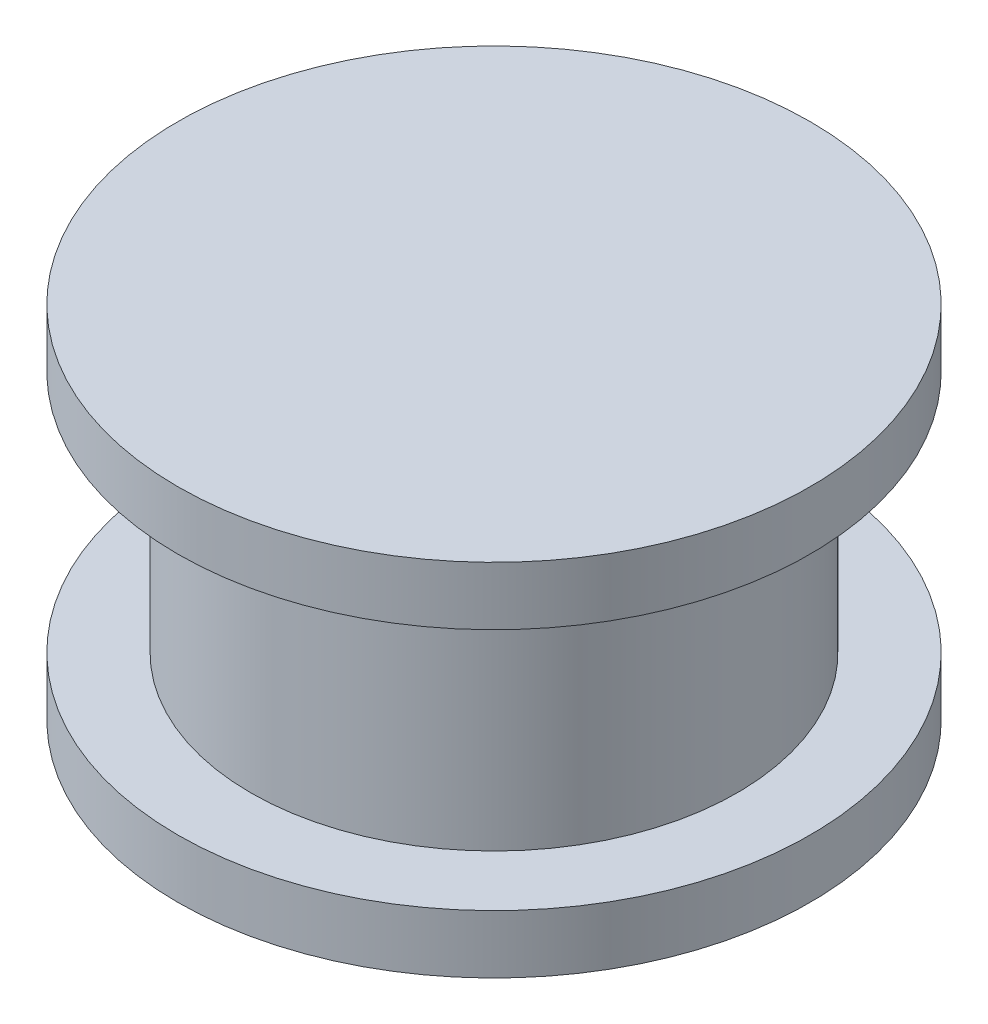
ISO-10303-21;
HEADER;
FILE_DESCRIPTION(('STEP AP214'),'2;1');
FILE_NAME('part.step','',(''),(''),'','','');
FILE_SCHEMA(('AUTOMOTIVE_DESIGN { 1 0 10303 214 1 1 1 1 }'));
ENDSEC;
DATA;
#1=APPLICATION_CONTEXT('core data for automotive mechanical design processes');
#2=APPLICATION_PROTOCOL_DEFINITION('international standard','automotive_design',2000,#1);
#3=PRODUCT_CONTEXT('',#1,'mechanical');
#4=PRODUCT('Part','Part','',(#3));
#5=PRODUCT_RELATED_PRODUCT_CATEGORY('part','',(#4));
#6=PRODUCT_DEFINITION_FORMATION('','',#4);
#7=PRODUCT_DEFINITION_CONTEXT('part definition',#1,'design');
#8=PRODUCT_DEFINITION('design','',#6,#7);
#9=PRODUCT_DEFINITION_SHAPE('','',#8);
#10=(LENGTH_UNIT() NAMED_UNIT(*) SI_UNIT(.MILLI.,.METRE.));
#11=(NAMED_UNIT(*) PLANE_ANGLE_UNIT() SI_UNIT($,.RADIAN.));
#12=(NAMED_UNIT(*) SI_UNIT($,.STERADIAN.) SOLID_ANGLE_UNIT());
#13=UNCERTAINTY_MEASURE_WITH_UNIT(LENGTH_MEASURE(1.E-05),#10,'distance_accuracy_value','');
#14=(GEOMETRIC_REPRESENTATION_CONTEXT(3) GLOBAL_UNCERTAINTY_ASSIGNED_CONTEXT((#13)) GLOBAL_UNIT_ASSIGNED_CONTEXT((#10,
#11,#12)) REPRESENTATION_CONTEXT('',''));
#15=CARTESIAN_POINT('',(0.,0.,0.));
#16=DIRECTION('',(0.,0.,1.));
#17=DIRECTION('',(1.,0.,0.));
#18=AXIS2_PLACEMENT_3D('',#15,#16,#17);
#19=CARTESIAN_POINT('',(0.,5.,0.));
#20=DIRECTION('',(0.,-1.,0.));
#21=DIRECTION('',(0.,0.,-1.));
#22=AXIS2_PLACEMENT_3D('',#19,#20,#21);
#23=CYLINDRICAL_SURFACE('',#22,5.);
#24=CARTESIAN_POINT('',(0.,5.,0.));
#25=DIRECTION('',(0.,1.,0.));
#26=DIRECTION('',(0.,0.,1.));
#27=AXIS2_PLACEMENT_3D('',#24,#25,#26);
#28=CIRCLE('',#27,5.);
#29=CARTESIAN_POINT('',(0.,5.,5.));
#30=VERTEX_POINT('',#29);
#31=EDGE_CURVE('E10',#30,#30,#28,.T.);
#32=ORIENTED_EDGE('',*,*,#31,.F.);
#33=EDGE_LOOP('',(#32));
#34=FACE_BOUND('',#33,.T.);
#35=CARTESIAN_POINT('',(0.,0.,0.));
#36=DIRECTION('',(0.,1.,0.));
#37=DIRECTION('',(0.,0.,1.));
#38=AXIS2_PLACEMENT_3D('',#35,#36,#37);
#39=CIRCLE('',#38,5.);
#40=CARTESIAN_POINT('',(0.,0.,5.));
#41=VERTEX_POINT('',#40);
#42=EDGE_CURVE('E34',#41,#41,#39,.T.);
#43=ORIENTED_EDGE('',*,*,#42,.T.);
#44=EDGE_LOOP('',(#43));
#45=FACE_BOUND('',#44,.T.);
#46=ADVANCED_FACE('F31',(#34,#45),#23,.T.);
#47=CARTESIAN_POINT('',(0.,6.2,0.));
#48=DIRECTION('',(0.,-1.,0.));
#49=DIRECTION('',(0.,0.,-1.));
#50=AXIS2_PLACEMENT_3D('',#47,#48,#49);
#51=CYLINDRICAL_SURFACE('',#50,6.5);
#52=CARTESIAN_POINT('',(0.,6.2,0.));
#53=DIRECTION('',(0.,1.,0.));
#54=DIRECTION('',(0.,0.,1.));
#55=AXIS2_PLACEMENT_3D('',#52,#53,#54);
#56=CIRCLE('',#55,6.5);
#57=CARTESIAN_POINT('',(0.,6.2,6.5));
#58=VERTEX_POINT('',#57);
#59=EDGE_CURVE('E38',#58,#58,#56,.T.);
#60=ORIENTED_EDGE('',*,*,#59,.F.);
#61=EDGE_LOOP('',(#60));
#62=FACE_BOUND('',#61,.T.);
#63=CARTESIAN_POINT('',(0.,5.,0.));
#64=DIRECTION('',(0.,1.,0.));
#65=DIRECTION('',(0.,0.,1.));
#66=AXIS2_PLACEMENT_3D('',#63,#64,#65);
#67=CIRCLE('',#66,6.5);
#68=CARTESIAN_POINT('',(0.,5.,6.5));
#69=VERTEX_POINT('',#68);
#70=EDGE_CURVE('E42',#69,#69,#67,.T.);
#71=ORIENTED_EDGE('',*,*,#70,.T.);
#72=EDGE_LOOP('',(#71));
#73=FACE_BOUND('',#72,.T.);
#74=ADVANCED_FACE('F79',(#62,#73),#51,.T.);
#75=CARTESIAN_POINT('',(0.,6.2,0.));
#76=DIRECTION('',(0.,1.,0.));
#77=DIRECTION('',(0.,0.,1.));
#78=AXIS2_PLACEMENT_3D('',#75,#76,#77);
#79=PLANE('',#78);
#80=ORIENTED_EDGE('',*,*,#59,.T.);
#81=EDGE_LOOP('',(#80));
#82=FACE_BOUND('',#81,.T.);
#83=ADVANCED_FACE('F75',(#82),#79,.T.);
#84=CARTESIAN_POINT('',(0.,5.,0.));
#85=DIRECTION('',(0.,1.,0.));
#86=DIRECTION('',(0.,0.,1.));
#87=AXIS2_PLACEMENT_3D('',#84,#85,#86);
#88=PLANE('',#87);
#89=ORIENTED_EDGE('',*,*,#31,.T.);
#90=EDGE_LOOP('',(#89));
#91=FACE_BOUND('',#90,.T.);
#92=ORIENTED_EDGE('',*,*,#70,.F.);
#93=EDGE_LOOP('',(#92));
#94=FACE_BOUND('',#93,.T.);
#95=ADVANCED_FACE('F67',(#91,#94),#88,.F.);
#96=CARTESIAN_POINT('',(0.,-1.2,0.));
#97=DIRECTION('',(0.,1.,0.));
#98=DIRECTION('',(0.,0.,1.));
#99=AXIS2_PLACEMENT_3D('',#96,#97,#98);
#100=CYLINDRICAL_SURFACE('',#99,6.5);
#101=CARTESIAN_POINT('',(0.,-1.2,0.));
#102=DIRECTION('',(0.,-1.,0.));
#103=DIRECTION('',(0.,0.,-1.));
#104=AXIS2_PLACEMENT_3D('',#101,#102,#103);
#105=CIRCLE('',#104,6.5);
#106=CARTESIAN_POINT('',(0.,-1.2,-6.5));
#107=VERTEX_POINT('',#106);
#108=EDGE_CURVE('E50',#107,#107,#105,.T.);
#109=ORIENTED_EDGE('',*,*,#108,.F.);
#110=EDGE_LOOP('',(#109));
#111=FACE_BOUND('',#110,.T.);
#112=CARTESIAN_POINT('',(0.,0.,0.));
#113=DIRECTION('',(0.,-1.,0.));
#114=DIRECTION('',(0.,0.,-1.));
#115=AXIS2_PLACEMENT_3D('',#112,#113,#114);
#116=CIRCLE('',#115,6.5);
#117=CARTESIAN_POINT('',(0.,0.,-6.5));
#118=VERTEX_POINT('',#117);
#119=EDGE_CURVE('E47',#118,#118,#116,.T.);
#120=ORIENTED_EDGE('',*,*,#119,.T.);
#121=EDGE_LOOP('',(#120));
#122=FACE_BOUND('',#121,.T.);
#123=ADVANCED_FACE('F65',(#111,#122),#100,.T.);
#124=CARTESIAN_POINT('',(0.,-1.2,0.));
#125=DIRECTION('',(0.,-1.,0.));
#126=DIRECTION('',(0.,0.,-1.));
#127=AXIS2_PLACEMENT_3D('',#124,#125,#126);
#128=PLANE('',#127);
#129=ORIENTED_EDGE('',*,*,#108,.T.);
#130=EDGE_LOOP('',(#129));
#131=FACE_BOUND('',#130,.T.);
#132=ADVANCED_FACE('F61',(#131),#128,.T.);
#133=CARTESIAN_POINT('',(0.,0.,0.));
#134=DIRECTION('',(0.,-1.,0.));
#135=DIRECTION('',(0.,0.,-1.));
#136=AXIS2_PLACEMENT_3D('',#133,#134,#135);
#137=PLANE('',#136);
#138=ORIENTED_EDGE('',*,*,#42,.F.);
#139=EDGE_LOOP('',(#138));
#140=FACE_BOUND('',#139,.T.);
#141=ORIENTED_EDGE('',*,*,#119,.F.);
#142=EDGE_LOOP('',(#141));
#143=FACE_BOUND('',#142,.T.);
#144=ADVANCED_FACE('F58',(#140,#143),#137,.F.);
#145=CLOSED_SHELL('',(#46,#74,#83,#95,#123,#132,#144));
#146=MANIFOLD_SOLID_BREP('B2',#145);
#147=ADVANCED_BREP_SHAPE_REPRESENTATION('',(#18,#146),#14);
#148=SHAPE_DEFINITION_REPRESENTATION(#9,#147);
ENDSEC;
END-ISO-10303-21;
